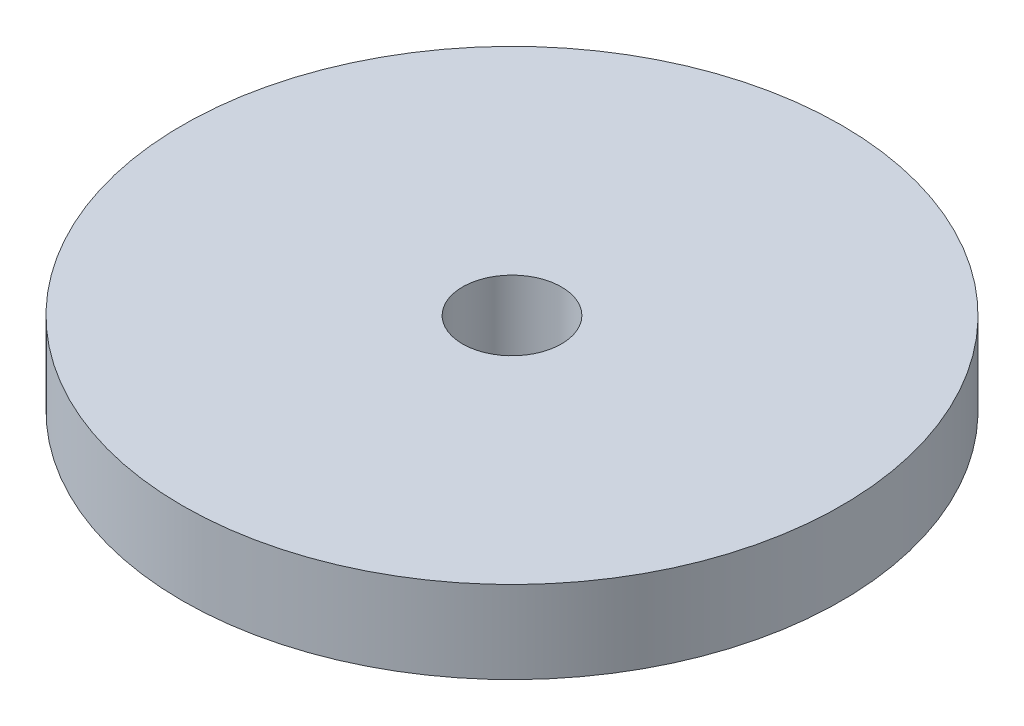
ISO-10303-21;
HEADER;
FILE_DESCRIPTION(('STEP AP214'),'2;1');
FILE_NAME('part.step','',(''),(''),'','','');
FILE_SCHEMA(('AUTOMOTIVE_DESIGN { 1 0 10303 214 1 1 1 1 }'));
ENDSEC;
DATA;
#1=APPLICATION_CONTEXT('core data for automotive mechanical design processes');
#2=APPLICATION_PROTOCOL_DEFINITION('international standard','automotive_design',2000,#1);
#3=PRODUCT_CONTEXT('',#1,'mechanical');
#4=PRODUCT('Part','Part','',(#3));
#5=PRODUCT_RELATED_PRODUCT_CATEGORY('part','',(#4));
#6=PRODUCT_DEFINITION_FORMATION('','',#4);
#7=PRODUCT_DEFINITION_CONTEXT('part definition',#1,'design');
#8=PRODUCT_DEFINITION('design','',#6,#7);
#9=PRODUCT_DEFINITION_SHAPE('','',#8);
#10=(LENGTH_UNIT() NAMED_UNIT(*) SI_UNIT(.MILLI.,.METRE.));
#11=(NAMED_UNIT(*) PLANE_ANGLE_UNIT() SI_UNIT($,.RADIAN.));
#12=(NAMED_UNIT(*) SI_UNIT($,.STERADIAN.) SOLID_ANGLE_UNIT());
#13=UNCERTAINTY_MEASURE_WITH_UNIT(LENGTH_MEASURE(1.E-05),#10,'distance_accuracy_value','');
#14=(GEOMETRIC_REPRESENTATION_CONTEXT(3) GLOBAL_UNCERTAINTY_ASSIGNED_CONTEXT((#13)) GLOBAL_UNIT_ASSIGNED_CONTEXT((#10,
#11,#12)) REPRESENTATION_CONTEXT('',''));
#15=CARTESIAN_POINT('',(0.,0.,0.));
#16=DIRECTION('',(0.,0.,1.));
#17=DIRECTION('',(1.,0.,0.));
#18=AXIS2_PLACEMENT_3D('',#15,#16,#17);
#19=CARTESIAN_POINT('',(0.,2.5,0.));
#20=DIRECTION('',(0.,1.,0.));
#21=DIRECTION('',(0.,0.,1.));
#22=AXIS2_PLACEMENT_3D('',#19,#20,#21);
#23=PLANE('',#22);
#24=CARTESIAN_POINT('',(0.,2.5,0.));
#25=DIRECTION('',(0.,1.,0.));
#26=DIRECTION('',(0.,0.,1.));
#27=AXIS2_PLACEMENT_3D('',#24,#25,#26);
#28=CIRCLE('',#27,10.);
#29=CARTESIAN_POINT('',(0.,2.5,10.));
#30=VERTEX_POINT('',#29);
#31=EDGE_CURVE('E10',#30,#30,#28,.T.);
#32=ORIENTED_EDGE('',*,*,#31,.T.);
#33=EDGE_LOOP('',(#32));
#34=FACE_BOUND('',#33,.T.);
#35=CARTESIAN_POINT('',(0.,2.5,0.));
#36=DIRECTION('',(0.,1.,0.));
#37=DIRECTION('',(0.,0.,1.));
#38=AXIS2_PLACEMENT_3D('',#35,#36,#37);
#39=CIRCLE('',#38,1.5);
#40=CARTESIAN_POINT('',(0.,2.5,1.5));
#41=VERTEX_POINT('',#40);
#42=EDGE_CURVE('E42',#41,#41,#39,.T.);
#43=ORIENTED_EDGE('',*,*,#42,.F.);
#44=EDGE_LOOP('',(#43));
#45=FACE_BOUND('',#44,.T.);
#46=ADVANCED_FACE('F31',(#34,#45),#23,.T.);
#47=CARTESIAN_POINT('',(0.,0.,0.));
#48=DIRECTION('',(0.,1.,0.));
#49=DIRECTION('',(0.,0.,1.));
#50=AXIS2_PLACEMENT_3D('',#47,#48,#49);
#51=PLANE('',#50);
#52=CARTESIAN_POINT('',(0.,0.,0.));
#53=DIRECTION('',(0.,1.,0.));
#54=DIRECTION('',(0.,0.,1.));
#55=AXIS2_PLACEMENT_3D('',#52,#53,#54);
#56=CIRCLE('',#55,10.);
#57=CARTESIAN_POINT('',(0.,0.,10.));
#58=VERTEX_POINT('',#57);
#59=EDGE_CURVE('E35',#58,#58,#56,.T.);
#60=ORIENTED_EDGE('',*,*,#59,.F.);
#61=EDGE_LOOP('',(#60));
#62=FACE_BOUND('',#61,.T.);
#63=CARTESIAN_POINT('',(0.,0.,0.));
#64=DIRECTION('',(0.,1.,0.));
#65=DIRECTION('',(0.,0.,1.));
#66=AXIS2_PLACEMENT_3D('',#63,#64,#65);
#67=CIRCLE('',#66,1.5);
#68=CARTESIAN_POINT('',(0.,0.,1.5));
#69=VERTEX_POINT('',#68);
#70=EDGE_CURVE('E44',#69,#69,#67,.T.);
#71=ORIENTED_EDGE('',*,*,#70,.T.);
#72=EDGE_LOOP('',(#71));
#73=FACE_BOUND('',#72,.T.);
#74=ADVANCED_FACE('F54',(#62,#73),#51,.F.);
#75=CARTESIAN_POINT('',(0.,2.5,0.));
#76=DIRECTION('',(0.,-1.,0.));
#77=DIRECTION('',(0.,0.,-1.));
#78=AXIS2_PLACEMENT_3D('',#75,#76,#77);
#79=CYLINDRICAL_SURFACE('',#78,10.);
#80=ORIENTED_EDGE('',*,*,#31,.F.);
#81=EDGE_LOOP('',(#80));
#82=FACE_BOUND('',#81,.T.);
#83=ORIENTED_EDGE('',*,*,#59,.T.);
#84=EDGE_LOOP('',(#83));
#85=FACE_BOUND('',#84,.T.);
#86=ADVANCED_FACE('F33',(#82,#85),#79,.T.);
#87=CARTESIAN_POINT('',(0.,2.5,0.));
#88=DIRECTION('',(0.,-1.,0.));
#89=DIRECTION('',(0.,0.,-1.));
#90=AXIS2_PLACEMENT_3D('',#87,#88,#89);
#91=CYLINDRICAL_SURFACE('',#90,1.5);
#92=ORIENTED_EDGE('',*,*,#42,.T.);
#93=EDGE_LOOP('',(#92));
#94=FACE_BOUND('',#93,.T.);
#95=ORIENTED_EDGE('',*,*,#70,.F.);
#96=EDGE_LOOP('',(#95));
#97=FACE_BOUND('',#96,.T.);
#98=ADVANCED_FACE('F50',(#94,#97),#91,.F.);
#99=CLOSED_SHELL('',(#46,#74,#86,#98));
#100=MANIFOLD_SOLID_BREP('B2',#99);
#101=ADVANCED_BREP_SHAPE_REPRESENTATION('',(#18,#100),#14);
#102=SHAPE_DEFINITION_REPRESENTATION(#9,#101);
ENDSEC;
END-ISO-10303-21;
